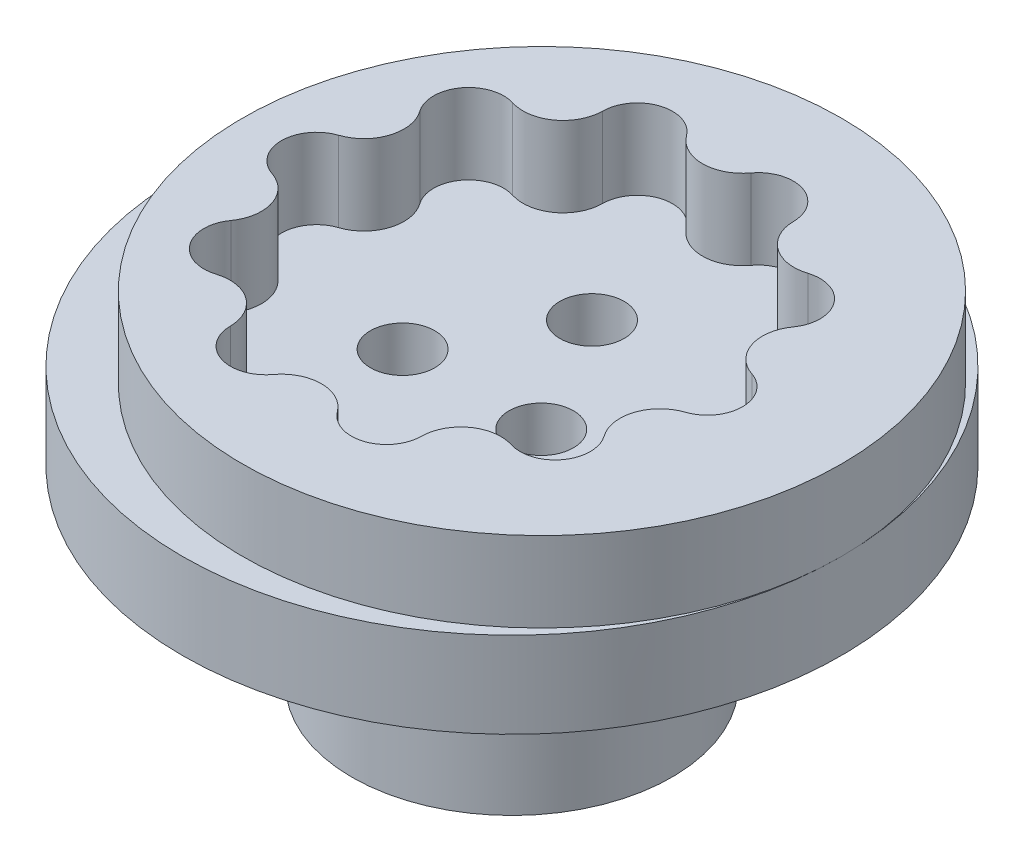
ISO-10303-21;
HEADER;
FILE_DESCRIPTION(('STEP AP214'),'2;1');
FILE_NAME('part.step','',(''),(''),'','','');
FILE_SCHEMA(('AUTOMOTIVE_DESIGN { 1 0 10303 214 1 1 1 1 }'));
ENDSEC;
DATA;
#1=APPLICATION_CONTEXT('core data for automotive mechanical design processes');
#2=APPLICATION_PROTOCOL_DEFINITION('international standard','automotive_design',2000,#1);
#3=PRODUCT_CONTEXT('',#1,'mechanical');
#4=PRODUCT('Part','Part','',(#3));
#5=PRODUCT_RELATED_PRODUCT_CATEGORY('part','',(#4));
#6=PRODUCT_DEFINITION_FORMATION('','',#4);
#7=PRODUCT_DEFINITION_CONTEXT('part definition',#1,'design');
#8=PRODUCT_DEFINITION('design','',#6,#7);
#9=PRODUCT_DEFINITION_SHAPE('','',#8);
#10=(LENGTH_UNIT() NAMED_UNIT(*) SI_UNIT(.MILLI.,.METRE.));
#11=(NAMED_UNIT(*) PLANE_ANGLE_UNIT() SI_UNIT($,.RADIAN.));
#12=(NAMED_UNIT(*) SI_UNIT($,.STERADIAN.) SOLID_ANGLE_UNIT());
#13=UNCERTAINTY_MEASURE_WITH_UNIT(LENGTH_MEASURE(1.E-05),#10,'distance_accuracy_value','');
#14=(GEOMETRIC_REPRESENTATION_CONTEXT(3) GLOBAL_UNCERTAINTY_ASSIGNED_CONTEXT((#13)) GLOBAL_UNIT_ASSIGNED_CONTEXT((#10,
#11,#12)) REPRESENTATION_CONTEXT('',''));
#15=CARTESIAN_POINT('',(0.,0.,0.));
#16=DIRECTION('',(0.,0.,1.));
#17=DIRECTION('',(1.,0.,0.));
#18=AXIS2_PLACEMENT_3D('',#15,#16,#17);
#19=CARTESIAN_POINT('',(0.,-6.810375,0.));
#20=DIRECTION('',(0.,1.,0.));
#21=DIRECTION('',(0.,0.,1.));
#22=AXIS2_PLACEMENT_3D('',#19,#20,#21);
#23=CYLINDRICAL_SURFACE('',#22,26.14295);
#24=CARTESIAN_POINT('',(0.,-6.810375,0.));
#25=DIRECTION('',(0.,1.,0.));
#26=DIRECTION('',(0.,0.,1.));
#27=AXIS2_PLACEMENT_3D('',#24,#25,#26);
#28=CIRCLE('',#27,26.14295);
#29=CARTESIAN_POINT('',(0.,-6.810375,26.14295));
#30=VERTEX_POINT('',#29);
#31=EDGE_CURVE('E335',#30,#30,#28,.T.);
#32=ORIENTED_EDGE('',*,*,#31,.T.);
#33=EDGE_LOOP('',(#32));
#34=FACE_BOUND('',#33,.T.);
#35=CARTESIAN_POINT('',(0.,0.,0.));
#36=DIRECTION('',(0.,1.,0.));
#37=DIRECTION('',(0.,0.,1.));
#38=AXIS2_PLACEMENT_3D('',#35,#36,#37);
#39=CIRCLE('',#38,26.14295);
#40=CARTESIAN_POINT('',(26.14295,0.,0.));
#41=VERTEX_POINT('',#40);
#42=EDGE_CURVE('E11',#41,#41,#39,.F.);
#43=ORIENTED_EDGE('',*,*,#42,.T.);
#44=EDGE_LOOP('',(#43));
#45=FACE_BOUND('',#44,.T.);
#46=ADVANCED_FACE('F38',(#34,#45),#23,.T.);
#47=CARTESIAN_POINT('',(0.,6.35,0.));
#48=DIRECTION('',(0.,1.,0.));
#49=DIRECTION('',(0.,0.,1.));
#50=AXIS2_PLACEMENT_3D('',#47,#48,#49);
#51=PLANE('',#50);
#52=CARTESIAN_POINT('',(-10.7494166939248,6.35,-14.795302793129));
#53=DIRECTION('',(0.,-1.,0.));
#54=DIRECTION('',(0.,0.,1.));
#55=AXIS2_PLACEMENT_3D('',#52,#53,#54);
#56=CIRCLE('',#55,3.175);
#57=CARTESIAN_POINT('',(-7.57452672067544,6.35,-14.7688706581247));
#58=VERTEX_POINT('',#57);
#59=CARTESIAN_POINT('',(-11.705373196694,6.35,-11.7676350166362));
#60=VERTEX_POINT('',#59);
#61=EDGE_CURVE('E202',#58,#60,#56,.T.);
#62=ORIENTED_EDGE('',*,*,#61,.F.);
#63=CARTESIAN_POINT('',(-4.79116776815351,6.35,-14.7456981638907));
#64=DIRECTION('',(0.,1.,0.));
#65=DIRECTION('',(0.,0.,-1.));
#66=AXIS2_PLACEMENT_3D('',#63,#64,#65);
#67=CIRCLE('',#66,2.78345541064933);
#68=CARTESIAN_POINT('',(-2.55300352448717,6.35,-16.4004624496567));
#69=VERTEX_POINT('',#68);
#70=EDGE_CURVE('E188',#69,#58,#67,.T.);
#71=ORIENTED_EDGE('',*,*,#70,.F.);
#72=CARTESIAN_POINT('',(0.,6.35,-18.288));
#73=DIRECTION('',(0.,-1.,0.));
#74=DIRECTION('',(0.,0.,-1.));
#75=AXIS2_PLACEMENT_3D('',#72,#73,#74);
#76=CIRCLE('',#75,3.175);
#77=CARTESIAN_POINT('',(2.55300352448717,6.35,-16.4004624496567));
#78=VERTEX_POINT('',#77);
#79=EDGE_CURVE('E177',#78,#69,#76,.T.);
#80=ORIENTED_EDGE('',*,*,#79,.F.);
#81=CARTESIAN_POINT('',(4.79116776815351,6.35,-14.7456981638907));
#82=DIRECTION('',(0.,1.,0.));
#83=DIRECTION('',(0.,0.,-1.));
#84=AXIS2_PLACEMENT_3D('',#81,#82,#83);
#85=CIRCLE('',#84,2.78345541064932);
#86=CARTESIAN_POINT('',(7.57452672067544,6.35,-14.7688706581247));
#87=VERTEX_POINT('',#86);
#88=EDGE_CURVE('E239',#87,#78,#85,.T.);
#89=ORIENTED_EDGE('',*,*,#88,.F.);
#90=CARTESIAN_POINT('',(10.7494166939248,6.35,-14.795302793129));
#91=DIRECTION('',(0.,-1.,0.));
#92=DIRECTION('',(0.,0.,1.));
#93=AXIS2_PLACEMENT_3D('',#90,#91,#92);
#94=CIRCLE('',#93,3.175);
#95=CARTESIAN_POINT('',(11.7053731966939,6.35,-11.7676350166362));
#96=VERTEX_POINT('',#95);
#97=EDGE_CURVE('E237',#96,#87,#94,.T.);
#98=ORIENTED_EDGE('',*,*,#97,.F.);
#99=CARTESIAN_POINT('',(12.5434400628289,6.35,-9.11334265313137));
#100=DIRECTION('',(0.,1.,0.));
#101=DIRECTION('',(0.,0.,-1.));
#102=AXIS2_PLACEMENT_3D('',#99,#100,#101);
#103=CIRCLE('',#102,2.78345541064933);
#104=CARTESIAN_POINT('',(14.8088452072343,6.35,-7.49607225064008));
#105=VERTEX_POINT('',#104);
#106=EDGE_CURVE('E235',#105,#96,#103,.T.);
#107=ORIENTED_EDGE('',*,*,#106,.F.);
#108=CARTESIAN_POINT('',(17.3929215700058,6.35,-5.65130279312901));
#109=DIRECTION('',(0.,-1.,0.));
#110=DIRECTION('',(0.,0.,1.));
#111=AXIS2_PLACEMENT_3D('',#108,#109,#110);
#112=CIRCLE('',#111,3.175);
#113=CARTESIAN_POINT('',(16.3866881587656,6.35,-2.63997097446405));
#114=VERTEX_POINT('',#113);
#115=EDGE_CURVE('E233',#114,#105,#112,.T.);
#116=ORIENTED_EDGE('',*,*,#115,.F.);
#117=CARTESIAN_POINT('',(15.5045445893507,6.35,0.));
#118=DIRECTION('',(0.,1.,0.));
#119=DIRECTION('',(0.,0.,-1.));
#120=AXIS2_PLACEMENT_3D('',#117,#118,#119);
#121=CIRCLE('',#120,2.78345541064933);
#122=CARTESIAN_POINT('',(16.3866881587657,6.35,2.63997097446412));
#123=VERTEX_POINT('',#122);
#124=EDGE_CURVE('E231',#123,#114,#121,.T.);
#125=ORIENTED_EDGE('',*,*,#124,.F.);
#126=CARTESIAN_POINT('',(17.3929215700058,6.35,5.65130279312908));
#127=DIRECTION('',(0.,-1.,0.));
#128=DIRECTION('',(0.,0.,1.));
#129=AXIS2_PLACEMENT_3D('',#126,#127,#128);
#130=CIRCLE('',#129,3.175);
#131=CARTESIAN_POINT('',(14.8088452072343,6.35,7.49607225064015));
#132=VERTEX_POINT('',#131);
#133=EDGE_CURVE('E229',#132,#123,#130,.T.);
#134=ORIENTED_EDGE('',*,*,#133,.F.);
#135=CARTESIAN_POINT('',(12.5434400628288,6.35,9.11334265313143));
#136=DIRECTION('',(0.,1.,0.));
#137=DIRECTION('',(0.,0.,-1.));
#138=AXIS2_PLACEMENT_3D('',#135,#136,#137);
#139=CIRCLE('',#138,2.78345541064933);
#140=CARTESIAN_POINT('',(11.7053731966939,6.35,11.7676350166362));
#141=VERTEX_POINT('',#140);
#142=EDGE_CURVE('E227',#141,#132,#139,.T.);
#143=ORIENTED_EDGE('',*,*,#142,.F.);
#144=CARTESIAN_POINT('',(10.7494166939248,6.35,14.7953027931291));
#145=DIRECTION('',(0.,-1.,0.));
#146=DIRECTION('',(0.,0.,1.));
#147=AXIS2_PLACEMENT_3D('',#144,#145,#146);
#148=CIRCLE('',#147,3.175);
#149=CARTESIAN_POINT('',(7.57452672067542,6.35,14.7688706581247));
#150=VERTEX_POINT('',#149);
#151=EDGE_CURVE('E225',#150,#141,#148,.T.);
#152=ORIENTED_EDGE('',*,*,#151,.F.);
#153=CARTESIAN_POINT('',(4.79116776815349,6.35,14.7456981638908));
#154=DIRECTION('',(0.,1.,0.));
#155=DIRECTION('',(0.,0.,-1.));
#156=AXIS2_PLACEMENT_3D('',#153,#154,#155);
#157=CIRCLE('',#156,2.78345541064933);
#158=CARTESIAN_POINT('',(2.55300352448715,6.35,16.4004624496567));
#159=VERTEX_POINT('',#158);
#160=EDGE_CURVE('E223',#159,#150,#157,.T.);
#161=ORIENTED_EDGE('',*,*,#160,.F.);
#162=CARTESIAN_POINT('',(0.,6.35,18.288));
#163=DIRECTION('',(0.,-1.,0.));
#164=DIRECTION('',(0.,0.,1.));
#165=AXIS2_PLACEMENT_3D('',#162,#163,#164);
#166=CIRCLE('',#165,3.175);
#167=CARTESIAN_POINT('',(-2.55300352448719,6.35,16.4004624496567));
#168=VERTEX_POINT('',#167);
#169=EDGE_CURVE('E221',#168,#159,#166,.T.);
#170=ORIENTED_EDGE('',*,*,#169,.F.);
#171=CARTESIAN_POINT('',(-4.79116776815352,6.35,14.7456981638908));
#172=DIRECTION('',(0.,1.,0.));
#173=DIRECTION('',(0.,0.,-1.));
#174=AXIS2_PLACEMENT_3D('',#171,#172,#173);
#175=CIRCLE('',#174,2.78345541064933);
#176=CARTESIAN_POINT('',(-7.57452672067546,6.35,14.7688706581247));
#177=VERTEX_POINT('',#176);
#178=EDGE_CURVE('E219',#177,#168,#175,.T.);
#179=ORIENTED_EDGE('',*,*,#178,.F.);
#180=CARTESIAN_POINT('',(-10.7494166939248,6.35,14.7953027931291));
#181=DIRECTION('',(0.,-1.,0.));
#182=DIRECTION('',(0.,0.,1.));
#183=AXIS2_PLACEMENT_3D('',#180,#181,#182);
#184=CIRCLE('',#183,3.175);
#185=CARTESIAN_POINT('',(-11.705373196694,6.35,11.7676350166362));
#186=VERTEX_POINT('',#185);
#187=EDGE_CURVE('E217',#186,#177,#184,.T.);
#188=ORIENTED_EDGE('',*,*,#187,.F.);
#189=CARTESIAN_POINT('',(-12.5434400628289,6.35,9.11334265313142));
#190=DIRECTION('',(0.,1.,0.));
#191=DIRECTION('',(0.,0.,-1.));
#192=AXIS2_PLACEMENT_3D('',#189,#190,#191);
#193=CIRCLE('',#192,2.78345541064933);
#194=CARTESIAN_POINT('',(-14.8088452072343,6.35,7.49607225064014));
#195=VERTEX_POINT('',#194);
#196=EDGE_CURVE('E215',#195,#186,#193,.T.);
#197=ORIENTED_EDGE('',*,*,#196,.F.);
#198=CARTESIAN_POINT('',(-17.3929215700058,6.35,5.65130279312907));
#199=DIRECTION('',(0.,-1.,0.));
#200=DIRECTION('',(0.,0.,1.));
#201=AXIS2_PLACEMENT_3D('',#198,#199,#200);
#202=CIRCLE('',#201,3.175);
#203=CARTESIAN_POINT('',(-16.3866881587657,6.35,2.6399709744641));
#204=VERTEX_POINT('',#203);
#205=EDGE_CURVE('E213',#204,#195,#202,.T.);
#206=ORIENTED_EDGE('',*,*,#205,.F.);
#207=CARTESIAN_POINT('',(-15.5045445893507,6.35,0.));
#208=DIRECTION('',(0.,1.,0.));
#209=DIRECTION('',(0.,0.,-1.));
#210=AXIS2_PLACEMENT_3D('',#207,#208,#209);
#211=CIRCLE('',#210,2.78345541064933);
#212=CARTESIAN_POINT('',(-16.3866881587657,6.35,-2.63997097446407));
#213=VERTEX_POINT('',#212);
#214=EDGE_CURVE('E211',#213,#204,#211,.T.);
#215=ORIENTED_EDGE('',*,*,#214,.F.);
#216=CARTESIAN_POINT('',(-17.3929215700058,6.35,-5.65130279312902));
#217=DIRECTION('',(0.,-1.,0.));
#218=DIRECTION('',(0.,0.,1.));
#219=AXIS2_PLACEMENT_3D('',#216,#217,#218);
#220=CIRCLE('',#219,3.175);
#221=CARTESIAN_POINT('',(-14.8088452072343,6.35,-7.4960722506401));
#222=VERTEX_POINT('',#221);
#223=EDGE_CURVE('E209',#222,#213,#220,.T.);
#224=ORIENTED_EDGE('',*,*,#223,.F.);
#225=CARTESIAN_POINT('',(-12.5434400628289,6.35,-9.11334265313138));
#226=DIRECTION('',(0.,1.,0.));
#227=DIRECTION('',(0.,0.,-1.));
#228=AXIS2_PLACEMENT_3D('',#225,#226,#227);
#229=CIRCLE('',#228,2.78345541064933);
#230=EDGE_CURVE('E204',#60,#222,#229,.T.);
#231=ORIENTED_EDGE('',*,*,#230,.F.);
#232=EDGE_LOOP('',(#62,#71,#80,#89,#98,#107,#116,#125,#134,#143,#152,#161,#170,#179,#188,#197,
#206,#215,#224,#231));
#233=FACE_BOUND('',#232,.T.);
#234=CARTESIAN_POINT('',(2.38125,6.35,0.));
#235=DIRECTION('',(0.,1.,0.));
#236=DIRECTION('',(0.,0.,-1.));
#237=AXIS2_PLACEMENT_3D('',#234,#235,#236);
#238=CIRCLE('',#237,23.7617);
#239=CARTESIAN_POINT('',(2.38125,6.35,-23.7617));
#240=VERTEX_POINT('',#239);
#241=EDGE_CURVE('E357',#240,#240,#238,.T.);
#242=ORIENTED_EDGE('',*,*,#241,.T.);
#243=EDGE_LOOP('',(#242));
#244=FACE_BOUND('',#243,.T.);
#245=ADVANCED_FACE('F199',(#233,#244),#51,.T.);
#246=CARTESIAN_POINT('',(0.,-6.810375,0.));
#247=DIRECTION('',(0.,1.,0.));
#248=DIRECTION('',(0.,0.,1.));
#249=AXIS2_PLACEMENT_3D('',#246,#247,#248);
#250=PLANE('',#249);
#251=ORIENTED_EDGE('',*,*,#31,.F.);
#252=EDGE_LOOP('',(#251));
#253=FACE_BOUND('',#252,.T.);
#254=CARTESIAN_POINT('',(0.,-6.810375,0.));
#255=DIRECTION('',(0.,1.,0.));
#256=DIRECTION('',(0.,0.,1.));
#257=AXIS2_PLACEMENT_3D('',#254,#255,#256);
#258=CIRCLE('',#257,12.7);
#259=CARTESIAN_POINT('',(0.,-6.810375,12.7));
#260=VERTEX_POINT('',#259);
#261=EDGE_CURVE('E45',#260,#260,#258,.F.);
#262=ORIENTED_EDGE('',*,*,#261,.F.);
#263=EDGE_LOOP('',(#262));
#264=FACE_BOUND('',#263,.T.);
#265=ADVANCED_FACE('F375',(#253,#264),#250,.F.);
#266=CARTESIAN_POINT('',(0.,-21.891625,0.));
#267=DIRECTION('',(0.,1.,0.));
#268=DIRECTION('',(0.,0.,1.));
#269=AXIS2_PLACEMENT_3D('',#266,#267,#268);
#270=CYLINDRICAL_SURFACE('',#269,12.7);
#271=CARTESIAN_POINT('',(0.,-21.891625,0.));
#272=DIRECTION('',(0.,-1.,0.));
#273=DIRECTION('',(0.,0.,-1.));
#274=AXIS2_PLACEMENT_3D('',#271,#272,#273);
#275=CIRCLE('',#274,12.7);
#276=CARTESIAN_POINT('',(0.,-21.891625,12.7));
#277=VERTEX_POINT('',#276);
#278=EDGE_CURVE('E195',#277,#277,#275,.T.);
#279=CARTESIAN_POINT('',(0.,-21.891625,12.7));
#280=CARTESIAN_POINT('',(0.,-21.7345286458333,12.7));
#281=CARTESIAN_POINT('',(0.,-21.5774322916667,12.7));
#282=CARTESIAN_POINT('',(0.,-21.2632395833333,12.7));
#283=CARTESIAN_POINT('',(0.,-21.1061432291667,12.7));
#284=CARTESIAN_POINT('',(0.,-20.7919505208333,12.7));
#285=CARTESIAN_POINT('',(0.,-20.6348541666667,12.7));
#286=CARTESIAN_POINT('',(0.,-20.3206614583333,12.7));
#287=CARTESIAN_POINT('',(0.,-20.1635651041667,12.7));
#288=CARTESIAN_POINT('',(0.,-19.8493723958333,12.7));
#289=CARTESIAN_POINT('',(0.,-19.6922760416667,12.7));
#290=CARTESIAN_POINT('',(0.,-19.3780833333333,12.7));
#291=CARTESIAN_POINT('',(0.,-19.2209869791667,12.7));
#292=CARTESIAN_POINT('',(0.,-18.9067942708333,12.7));
#293=CARTESIAN_POINT('',(0.,-18.7496979166667,12.7));
#294=CARTESIAN_POINT('',(0.,-18.4355052083333,12.7));
#295=CARTESIAN_POINT('',(0.,-18.2784088541667,12.7));
#296=CARTESIAN_POINT('',(0.,-17.9642161458333,12.7));
#297=CARTESIAN_POINT('',(0.,-17.8071197916667,12.7));
#298=CARTESIAN_POINT('',(0.,-17.4929270833333,12.7));
#299=CARTESIAN_POINT('',(0.,-17.3358307291667,12.7));
#300=CARTESIAN_POINT('',(0.,-17.0216380208333,12.7));
#301=CARTESIAN_POINT('',(0.,-16.8645416666667,12.7));
#302=CARTESIAN_POINT('',(0.,-16.5503489583333,12.7));
#303=CARTESIAN_POINT('',(0.,-16.3932526041667,12.7));
#304=CARTESIAN_POINT('',(0.,-16.0790598958333,12.7));
#305=CARTESIAN_POINT('',(0.,-15.9219635416667,12.7));
#306=CARTESIAN_POINT('',(0.,-15.6077708333333,12.7));
#307=CARTESIAN_POINT('',(0.,-15.4506744791667,12.7));
#308=CARTESIAN_POINT('',(0.,-15.1364817708333,12.7));
#309=CARTESIAN_POINT('',(0.,-14.9793854166667,12.7));
#310=CARTESIAN_POINT('',(0.,-14.6651927083333,12.7));
#311=CARTESIAN_POINT('',(0.,-14.5080963541667,12.7));
#312=CARTESIAN_POINT('',(0.,-14.1939036458333,12.7));
#313=CARTESIAN_POINT('',(0.,-14.0368072916667,12.7));
#314=CARTESIAN_POINT('',(0.,-13.7226145833333,12.7));
#315=CARTESIAN_POINT('',(0.,-13.5655182291667,12.7));
#316=CARTESIAN_POINT('',(0.,-13.2513255208333,12.7));
#317=CARTESIAN_POINT('',(0.,-13.0942291666667,12.7));
#318=CARTESIAN_POINT('',(0.,-12.7800364583333,12.7));
#319=CARTESIAN_POINT('',(0.,-12.6229401041667,12.7));
#320=CARTESIAN_POINT('',(0.,-12.3087473958333,12.7));
#321=CARTESIAN_POINT('',(0.,-12.1516510416667,12.7));
#322=CARTESIAN_POINT('',(0.,-11.8374583333333,12.7));
#323=CARTESIAN_POINT('',(0.,-11.6803619791667,12.7));
#324=CARTESIAN_POINT('',(0.,-11.3661692708333,12.7));
#325=CARTESIAN_POINT('',(0.,-11.2090729166667,12.7));
#326=CARTESIAN_POINT('',(0.,-10.8948802083333,12.7));
#327=CARTESIAN_POINT('',(0.,-10.7377838541667,12.7));
#328=CARTESIAN_POINT('',(0.,-10.4235911458333,12.7));
#329=CARTESIAN_POINT('',(0.,-10.2664947916667,12.7));
#330=CARTESIAN_POINT('',(0.,-9.95230208333333,12.7));
#331=CARTESIAN_POINT('',(0.,-9.79520572916667,12.7));
#332=CARTESIAN_POINT('',(0.,-9.48101302083334,12.7));
#333=CARTESIAN_POINT('',(0.,-9.32391666666667,12.7));
#334=CARTESIAN_POINT('',(0.,-9.00972395833333,12.7));
#335=CARTESIAN_POINT('',(0.,-8.85262760416667,12.7));
#336=CARTESIAN_POINT('',(0.,-8.53843489583333,12.7));
#337=CARTESIAN_POINT('',(0.,-8.38133854166667,12.7));
#338=CARTESIAN_POINT('',(0.,-8.06714583333333,12.7));
#339=CARTESIAN_POINT('',(0.,-7.91004947916667,12.7));
#340=CARTESIAN_POINT('',(0.,-7.59585677083334,12.7));
#341=CARTESIAN_POINT('',(0.,-7.43876041666667,12.7));
#342=CARTESIAN_POINT('',(0.,-7.12456770833334,12.7));
#343=CARTESIAN_POINT('',(0.,-6.96747135416667,12.7));
#344=CARTESIAN_POINT('',(0.,-6.810375,12.7));
#345=B_SPLINE_CURVE_WITH_KNOTS('',3,(#279,#280,#281,#282,#283,#284,#285,#286,#287,#288,#289,
#290,#291,#292,#293,#294,#295,#296,#297,#298,#299,#300,#301,#302,#303,#304,#305,#306,#307,#308,
#309,#310,#311,#312,#313,#314,#315,#316,#317,#318,#319,#320,#321,#322,#323,#324,#325,#326,#327,
#328,#329,#330,#331,#332,#333,#334,#335,#336,#337,#338,#339,#340,#341,#342,#343,#344),
.UNSPECIFIED.,.F.,.F.,(4,2,2,2,2,2,2,2,2,2,2,2,2,2,2,2,2,2,2,2,2,2,2,2,2,2,2,2,2,2,2,2,4),(0.,
0.471289062499998,0.942578124999999,1.4138671875,1.88515625,2.3564453125,2.827734375,
3.2990234375,3.7703125,4.2416015625,4.712890625,5.1841796875,5.65546875,6.12675781249999,
6.598046875,7.0693359375,7.540625,8.0119140625,8.48320312499999,8.95449218749999,
9.42578124999999,9.89707031249999,10.368359375,10.8396484375,11.3109375,11.7822265625,
12.253515625,12.7248046875,13.19609375,13.6673828125,14.138671875,14.6099609375,15.08125),.UNSPECIFIED.);
#346=EDGE_CURVE('BSEAM368',#277,#260,#345,.T.);
#347=ORIENTED_EDGE('',*,*,#278,.F.);
#348=ORIENTED_EDGE('',*,*,#261,.T.);
#349=ORIENTED_EDGE('',*,*,#346,.T.);
#350=ORIENTED_EDGE('',*,*,#346,.F.);
#351=EDGE_LOOP('',(#347,#349,#348,#350));
#352=FACE_BOUND('',#351,.T.);
#353=ADVANCED_FACE('F368',(#352),#270,.T.);
#354=CARTESIAN_POINT('',(0.,-21.891625,0.));
#355=DIRECTION('',(0.,-1.,0.));
#356=DIRECTION('',(0.,0.,-1.));
#357=AXIS2_PLACEMENT_3D('',#354,#355,#356);
#358=PLANE('',#357);
#359=CARTESIAN_POINT('',(0.,-21.891625,-6.35));
#360=DIRECTION('',(0.,-1.,0.));
#361=DIRECTION('',(0.,0.,-1.));
#362=AXIS2_PLACEMENT_3D('',#359,#360,#361);
#363=CIRCLE('',#362,2.55269999999999);
#364=CARTESIAN_POINT('',(0.,-21.891625,-8.90269999999999));
#365=VERTEX_POINT('',#364);
#366=EDGE_CURVE('E348',#365,#365,#363,.T.);
#367=ORIENTED_EDGE('',*,*,#366,.F.);
#368=EDGE_LOOP('',(#367));
#369=FACE_BOUND('',#368,.T.);
#370=CARTESIAN_POINT('',(-5.49926131403113,-21.891625,3.1750000000001));
#371=DIRECTION('',(0.,-1.,0.));
#372=DIRECTION('',(0.,0.,-1.));
#373=AXIS2_PLACEMENT_3D('',#370,#371,#372);
#374=CIRCLE('',#373,2.55269999999999);
#375=CARTESIAN_POINT('',(-5.49926131403113,-21.891625,0.622300000000115));
#376=VERTEX_POINT('',#375);
#377=EDGE_CURVE('E345',#376,#376,#374,.T.);
#378=ORIENTED_EDGE('',*,*,#377,.F.);
#379=EDGE_LOOP('',(#378));
#380=FACE_BOUND('',#379,.T.);
#381=CARTESIAN_POINT('',(5.49926131403126,-21.891625,3.17499999999987));
#382=DIRECTION('',(0.,-1.,0.));
#383=DIRECTION('',(0.,0.,-1.));
#384=AXIS2_PLACEMENT_3D('',#381,#382,#383);
#385=CIRCLE('',#384,2.55269999999999);
#386=CARTESIAN_POINT('',(5.49926131403126,-21.891625,0.622299999999885));
#387=VERTEX_POINT('',#386);
#388=EDGE_CURVE('E342',#387,#387,#385,.T.);
#389=ORIENTED_EDGE('',*,*,#388,.F.);
#390=EDGE_LOOP('',(#389));
#391=FACE_BOUND('',#390,.T.);
#392=ORIENTED_EDGE('',*,*,#278,.T.);
#393=EDGE_LOOP('',(#392));
#394=FACE_BOUND('',#393,.T.);
#395=ADVANCED_FACE('F365',(#369,#380,#391,#394),#358,.T.);
#396=CARTESIAN_POINT('',(-4.79116776815351,6.35,-14.7456981638907));
#397=DIRECTION('',(0.,-1.,0.));
#398=DIRECTION('',(0.,0.,-1.));
#399=AXIS2_PLACEMENT_3D('',#396,#397,#398);
#400=CYLINDRICAL_SURFACE('',#399,2.78345541064933);
#401=CARTESIAN_POINT('',(-4.79116776815351,0.,-14.7456981638907));
#402=DIRECTION('',(0.,1.,0.));
#403=DIRECTION('',(0.,0.,-1.));
#404=AXIS2_PLACEMENT_3D('',#401,#402,#403);
#405=CIRCLE('',#404,2.78345541064933);
#406=CARTESIAN_POINT('',(-2.55300352448718,0.,-16.4004624496567));
#407=VERTEX_POINT('',#406);
#408=CARTESIAN_POINT('',(-7.57452672067543,0.,-14.7688706581247));
#409=VERTEX_POINT('',#408);
#410=EDGE_CURVE('E58',#407,#409,#405,.T.);
#411=ORIENTED_EDGE('',*,*,#410,.F.);
#412=DIRECTION('',(0.,-1.,0.));
#413=VECTOR('',#412,1.);
#414=CARTESIAN_POINT('',(-2.55300352448717,6.35,-16.4004624496567));
#415=LINE('',#414,#413);
#416=EDGE_CURVE('E181',#69,#407,#415,.T.);
#417=ORIENTED_EDGE('',*,*,#416,.F.);
#418=ORIENTED_EDGE('',*,*,#70,.T.);
#419=DIRECTION('',(0.,-1.,0.));
#420=VECTOR('',#419,1.);
#421=CARTESIAN_POINT('',(-7.57452672067544,6.35,-14.7688706581247));
#422=LINE('',#421,#420);
#423=EDGE_CURVE('E196',#58,#409,#422,.T.);
#424=ORIENTED_EDGE('',*,*,#423,.T.);
#425=EDGE_LOOP('',(#411,#417,#418,#424));
#426=FACE_BOUND('',#425,.T.);
#427=ADVANCED_FACE('F192',(#426),#400,.F.);
#428=CARTESIAN_POINT('',(-10.7494166939248,6.35,-14.795302793129));
#429=DIRECTION('',(0.,-1.,0.));
#430=DIRECTION('',(0.,0.,-1.));
#431=AXIS2_PLACEMENT_3D('',#428,#429,#430);
#432=CYLINDRICAL_SURFACE('',#431,3.175);
#433=CARTESIAN_POINT('',(-10.7494166939248,0.,-14.795302793129));
#434=DIRECTION('',(0.,-1.,0.));
#435=DIRECTION('',(0.,0.,-1.));
#436=AXIS2_PLACEMENT_3D('',#433,#434,#435);
#437=CIRCLE('',#436,3.175);
#438=CARTESIAN_POINT('',(-11.705373196694,0.,-11.7676350166362));
#439=VERTEX_POINT('',#438);
#440=EDGE_CURVE('E242',#409,#439,#437,.T.);
#441=ORIENTED_EDGE('',*,*,#440,.F.);
#442=ORIENTED_EDGE('',*,*,#423,.F.);
#443=ORIENTED_EDGE('',*,*,#61,.T.);
#444=DIRECTION('',(0.,-1.,0.));
#445=VECTOR('',#444,1.);
#446=CARTESIAN_POINT('',(-11.705373196694,6.35,-11.7676350166362));
#447=LINE('',#446,#445);
#448=EDGE_CURVE('E329',#60,#439,#447,.T.);
#449=ORIENTED_EDGE('',*,*,#448,.T.);
#450=EDGE_LOOP('',(#441,#442,#443,#449));
#451=FACE_BOUND('',#450,.T.);
#452=ADVANCED_FACE('F484',(#451),#432,.T.);
#453=CARTESIAN_POINT('',(-12.5434400628289,6.35,-9.11334265313138));
#454=DIRECTION('',(0.,-1.,0.));
#455=DIRECTION('',(0.,0.,-1.));
#456=AXIS2_PLACEMENT_3D('',#453,#454,#455);
#457=CYLINDRICAL_SURFACE('',#456,2.78345541064933);
#458=CARTESIAN_POINT('',(-12.5434400628289,0.,-9.11334265313138));
#459=DIRECTION('',(0.,1.,0.));
#460=DIRECTION('',(0.,0.,-1.));
#461=AXIS2_PLACEMENT_3D('',#458,#459,#460);
#462=CIRCLE('',#461,2.78345541064933);
#463=CARTESIAN_POINT('',(-14.8088452072343,0.,-7.4960722506401));
#464=VERTEX_POINT('',#463);
#465=EDGE_CURVE('E245',#439,#464,#462,.T.);
#466=ORIENTED_EDGE('',*,*,#465,.F.);
#467=ORIENTED_EDGE('',*,*,#448,.F.);
#468=ORIENTED_EDGE('',*,*,#230,.T.);
#469=DIRECTION('',(0.,-1.,0.));
#470=VECTOR('',#469,1.);
#471=CARTESIAN_POINT('',(-14.8088452072343,6.35,-7.4960722506401));
#472=LINE('',#471,#470);
#473=EDGE_CURVE('E326',#222,#464,#472,.T.);
#474=ORIENTED_EDGE('',*,*,#473,.T.);
#475=EDGE_LOOP('',(#466,#467,#468,#474));
#476=FACE_BOUND('',#475,.T.);
#477=ADVANCED_FACE('F480',(#476),#457,.F.);
#478=CARTESIAN_POINT('',(-17.3929215700058,6.35,-5.65130279312903));
#479=DIRECTION('',(0.,-1.,0.));
#480=DIRECTION('',(0.,0.,-1.));
#481=AXIS2_PLACEMENT_3D('',#478,#479,#480);
#482=CYLINDRICAL_SURFACE('',#481,3.175);
#483=CARTESIAN_POINT('',(-17.3929215700058,0.,-5.65130279312903));
#484=DIRECTION('',(0.,-1.,0.));
#485=DIRECTION('',(0.,0.,-1.));
#486=AXIS2_PLACEMENT_3D('',#483,#484,#485);
#487=CIRCLE('',#486,3.175);
#488=CARTESIAN_POINT('',(-16.3866881587657,0.,-2.63997097446407));
#489=VERTEX_POINT('',#488);
#490=EDGE_CURVE('E247',#464,#489,#487,.T.);
#491=ORIENTED_EDGE('',*,*,#490,.F.);
#492=ORIENTED_EDGE('',*,*,#473,.F.);
#493=ORIENTED_EDGE('',*,*,#223,.T.);
#494=DIRECTION('',(0.,-1.,0.));
#495=VECTOR('',#494,1.);
#496=CARTESIAN_POINT('',(-16.3866881587657,6.35,-2.63997097446407));
#497=LINE('',#496,#495);
#498=EDGE_CURVE('E323',#213,#489,#497,.T.);
#499=ORIENTED_EDGE('',*,*,#498,.T.);
#500=EDGE_LOOP('',(#491,#492,#493,#499));
#501=FACE_BOUND('',#500,.T.);
#502=ADVANCED_FACE('F476',(#501),#482,.T.);
#503=CARTESIAN_POINT('',(-15.5045445893507,6.35,0.));
#504=DIRECTION('',(0.,-1.,0.));
#505=DIRECTION('',(0.,0.,-1.));
#506=AXIS2_PLACEMENT_3D('',#503,#504,#505);
#507=CYLINDRICAL_SURFACE('',#506,2.78345541064933);
#508=CARTESIAN_POINT('',(-15.5045445893507,0.,0.));
#509=DIRECTION('',(0.,1.,0.));
#510=DIRECTION('',(0.,0.,-1.));
#511=AXIS2_PLACEMENT_3D('',#508,#509,#510);
#512=CIRCLE('',#511,2.78345541064933);
#513=CARTESIAN_POINT('',(-16.3866881587657,0.,2.6399709744641));
#514=VERTEX_POINT('',#513);
#515=EDGE_CURVE('E249',#489,#514,#512,.T.);
#516=ORIENTED_EDGE('',*,*,#515,.F.);
#517=ORIENTED_EDGE('',*,*,#498,.F.);
#518=ORIENTED_EDGE('',*,*,#214,.T.);
#519=DIRECTION('',(0.,-1.,0.));
#520=VECTOR('',#519,1.);
#521=CARTESIAN_POINT('',(-16.3866881587657,6.35,2.6399709744641));
#522=LINE('',#521,#520);
#523=EDGE_CURVE('E320',#204,#514,#522,.T.);
#524=ORIENTED_EDGE('',*,*,#523,.T.);
#525=EDGE_LOOP('',(#516,#517,#518,#524));
#526=FACE_BOUND('',#525,.T.);
#527=ADVANCED_FACE('F472',(#526),#507,.F.);
#528=CARTESIAN_POINT('',(-17.3929215700058,6.35,5.65130279312906));
#529=DIRECTION('',(0.,-1.,0.));
#530=DIRECTION('',(0.,0.,-1.));
#531=AXIS2_PLACEMENT_3D('',#528,#529,#530);
#532=CYLINDRICAL_SURFACE('',#531,3.175);
#533=CARTESIAN_POINT('',(-17.3929215700058,0.,5.65130279312906));
#534=DIRECTION('',(0.,-1.,0.));
#535=DIRECTION('',(0.,0.,-1.));
#536=AXIS2_PLACEMENT_3D('',#533,#534,#535);
#537=CIRCLE('',#536,3.175);
#538=CARTESIAN_POINT('',(-14.8088452072343,0.,7.49607225064014));
#539=VERTEX_POINT('',#538);
#540=EDGE_CURVE('E251',#514,#539,#537,.T.);
#541=ORIENTED_EDGE('',*,*,#540,.F.);
#542=ORIENTED_EDGE('',*,*,#523,.F.);
#543=ORIENTED_EDGE('',*,*,#205,.T.);
#544=DIRECTION('',(0.,-1.,0.));
#545=VECTOR('',#544,1.);
#546=CARTESIAN_POINT('',(-14.8088452072343,6.35,7.49607225064014));
#547=LINE('',#546,#545);
#548=EDGE_CURVE('E317',#195,#539,#547,.T.);
#549=ORIENTED_EDGE('',*,*,#548,.T.);
#550=EDGE_LOOP('',(#541,#542,#543,#549));
#551=FACE_BOUND('',#550,.T.);
#552=ADVANCED_FACE('F468',(#551),#532,.T.);
#553=CARTESIAN_POINT('',(-12.5434400628289,6.35,9.11334265313142));
#554=DIRECTION('',(0.,-1.,0.));
#555=DIRECTION('',(0.,0.,-1.));
#556=AXIS2_PLACEMENT_3D('',#553,#554,#555);
#557=CYLINDRICAL_SURFACE('',#556,2.78345541064933);
#558=CARTESIAN_POINT('',(-12.5434400628289,0.,9.11334265313142));
#559=DIRECTION('',(0.,1.,0.));
#560=DIRECTION('',(0.,0.,-1.));
#561=AXIS2_PLACEMENT_3D('',#558,#559,#560);
#562=CIRCLE('',#561,2.78345541064933);
#563=CARTESIAN_POINT('',(-11.705373196694,0.,11.7676350166362));
#564=VERTEX_POINT('',#563);
#565=EDGE_CURVE('E253',#539,#564,#562,.T.);
#566=ORIENTED_EDGE('',*,*,#565,.F.);
#567=ORIENTED_EDGE('',*,*,#548,.F.);
#568=ORIENTED_EDGE('',*,*,#196,.T.);
#569=DIRECTION('',(0.,-1.,0.));
#570=VECTOR('',#569,1.);
#571=CARTESIAN_POINT('',(-11.705373196694,6.35,11.7676350166362));
#572=LINE('',#571,#570);
#573=EDGE_CURVE('E314',#186,#564,#572,.T.);
#574=ORIENTED_EDGE('',*,*,#573,.T.);
#575=EDGE_LOOP('',(#566,#567,#568,#574));
#576=FACE_BOUND('',#575,.T.);
#577=ADVANCED_FACE('F464',(#576),#557,.F.);
#578=CARTESIAN_POINT('',(-10.7494166939248,6.35,14.7953027931291));
#579=DIRECTION('',(0.,-1.,0.));
#580=DIRECTION('',(0.,0.,-1.));
#581=AXIS2_PLACEMENT_3D('',#578,#579,#580);
#582=CYLINDRICAL_SURFACE('',#581,3.175);
#583=CARTESIAN_POINT('',(-10.7494166939248,0.,14.7953027931291));
#584=DIRECTION('',(0.,-1.,0.));
#585=DIRECTION('',(0.,0.,-1.));
#586=AXIS2_PLACEMENT_3D('',#583,#584,#585);
#587=CIRCLE('',#586,3.175);
#588=CARTESIAN_POINT('',(-7.57452672067546,0.,14.7688706581247));
#589=VERTEX_POINT('',#588);
#590=EDGE_CURVE('E255',#564,#589,#587,.T.);
#591=ORIENTED_EDGE('',*,*,#590,.F.);
#592=ORIENTED_EDGE('',*,*,#573,.F.);
#593=ORIENTED_EDGE('',*,*,#187,.T.);
#594=DIRECTION('',(0.,-1.,0.));
#595=VECTOR('',#594,1.);
#596=CARTESIAN_POINT('',(-7.57452672067546,6.35,14.7688706581247));
#597=LINE('',#596,#595);
#598=EDGE_CURVE('E311',#177,#589,#597,.T.);
#599=ORIENTED_EDGE('',*,*,#598,.T.);
#600=EDGE_LOOP('',(#591,#592,#593,#599));
#601=FACE_BOUND('',#600,.T.);
#602=ADVANCED_FACE('F460',(#601),#582,.T.);
#603=CARTESIAN_POINT('',(-4.79116776815352,6.35,14.7456981638908));
#604=DIRECTION('',(0.,-1.,0.));
#605=DIRECTION('',(0.,0.,-1.));
#606=AXIS2_PLACEMENT_3D('',#603,#604,#605);
#607=CYLINDRICAL_SURFACE('',#606,2.78345541064933);
#608=CARTESIAN_POINT('',(-4.79116776815352,0.,14.7456981638908));
#609=DIRECTION('',(0.,1.,0.));
#610=DIRECTION('',(0.,0.,-1.));
#611=AXIS2_PLACEMENT_3D('',#608,#609,#610);
#612=CIRCLE('',#611,2.78345541064933);
#613=CARTESIAN_POINT('',(-2.55300352448719,0.,16.4004624496567));
#614=VERTEX_POINT('',#613);
#615=EDGE_CURVE('E257',#589,#614,#612,.T.);
#616=ORIENTED_EDGE('',*,*,#615,.F.);
#617=ORIENTED_EDGE('',*,*,#598,.F.);
#618=ORIENTED_EDGE('',*,*,#178,.T.);
#619=DIRECTION('',(0.,-1.,0.));
#620=VECTOR('',#619,1.);
#621=CARTESIAN_POINT('',(-2.55300352448719,6.35,16.4004624496567));
#622=LINE('',#621,#620);
#623=EDGE_CURVE('E308',#168,#614,#622,.T.);
#624=ORIENTED_EDGE('',*,*,#623,.T.);
#625=EDGE_LOOP('',(#616,#617,#618,#624));
#626=FACE_BOUND('',#625,.T.);
#627=ADVANCED_FACE('F456',(#626),#607,.F.);
#628=CARTESIAN_POINT('',(0.,6.35,18.288));
#629=DIRECTION('',(0.,-1.,0.));
#630=DIRECTION('',(0.,0.,-1.));
#631=AXIS2_PLACEMENT_3D('',#628,#629,#630);
#632=CYLINDRICAL_SURFACE('',#631,3.175);
#633=CARTESIAN_POINT('',(0.,0.,18.288));
#634=DIRECTION('',(0.,-1.,0.));
#635=DIRECTION('',(0.,0.,-1.));
#636=AXIS2_PLACEMENT_3D('',#633,#634,#635);
#637=CIRCLE('',#636,3.175);
#638=CARTESIAN_POINT('',(2.55300352448715,0.,16.4004624496567));
#639=VERTEX_POINT('',#638);
#640=EDGE_CURVE('E259',#614,#639,#637,.T.);
#641=ORIENTED_EDGE('',*,*,#640,.F.);
#642=ORIENTED_EDGE('',*,*,#623,.F.);
#643=ORIENTED_EDGE('',*,*,#169,.T.);
#644=DIRECTION('',(0.,-1.,0.));
#645=VECTOR('',#644,1.);
#646=CARTESIAN_POINT('',(2.55300352448715,6.35,16.4004624496567));
#647=LINE('',#646,#645);
#648=EDGE_CURVE('E305',#159,#639,#647,.T.);
#649=ORIENTED_EDGE('',*,*,#648,.T.);
#650=EDGE_LOOP('',(#641,#642,#643,#649));
#651=FACE_BOUND('',#650,.T.);
#652=ADVANCED_FACE('F452',(#651),#632,.T.);
#653=CARTESIAN_POINT('',(4.79116776815349,6.35,14.7456981638908));
#654=DIRECTION('',(0.,-1.,0.));
#655=DIRECTION('',(0.,0.,-1.));
#656=AXIS2_PLACEMENT_3D('',#653,#654,#655);
#657=CYLINDRICAL_SURFACE('',#656,2.78345541064933);
#658=CARTESIAN_POINT('',(4.79116776815349,0.,14.7456981638908));
#659=DIRECTION('',(0.,1.,0.));
#660=DIRECTION('',(0.,0.,-1.));
#661=AXIS2_PLACEMENT_3D('',#658,#659,#660);
#662=CIRCLE('',#661,2.78345541064933);
#663=CARTESIAN_POINT('',(7.57452672067541,0.,14.7688706581247));
#664=VERTEX_POINT('',#663);
#665=EDGE_CURVE('E261',#639,#664,#662,.T.);
#666=ORIENTED_EDGE('',*,*,#665,.F.);
#667=ORIENTED_EDGE('',*,*,#648,.F.);
#668=ORIENTED_EDGE('',*,*,#160,.T.);
#669=DIRECTION('',(0.,-1.,0.));
#670=VECTOR('',#669,1.);
#671=CARTESIAN_POINT('',(7.57452672067542,6.35,14.7688706581247));
#672=LINE('',#671,#670);
#673=EDGE_CURVE('E302',#150,#664,#672,.T.);
#674=ORIENTED_EDGE('',*,*,#673,.T.);
#675=EDGE_LOOP('',(#666,#667,#668,#674));
#676=FACE_BOUND('',#675,.T.);
#677=ADVANCED_FACE('F448',(#676),#657,.F.);
#678=CARTESIAN_POINT('',(10.7494166939247,6.35,14.7953027931291));
#679=DIRECTION('',(0.,-1.,0.));
#680=DIRECTION('',(0.,0.,-1.));
#681=AXIS2_PLACEMENT_3D('',#678,#679,#680);
#682=CYLINDRICAL_SURFACE('',#681,3.175);
#683=CARTESIAN_POINT('',(10.7494166939247,0.,14.7953027931291));
#684=DIRECTION('',(0.,-1.,0.));
#685=DIRECTION('',(0.,0.,-1.));
#686=AXIS2_PLACEMENT_3D('',#683,#684,#685);
#687=CIRCLE('',#686,3.175);
#688=CARTESIAN_POINT('',(11.7053731966939,0.,11.7676350166362));
#689=VERTEX_POINT('',#688);
#690=EDGE_CURVE('E263',#664,#689,#687,.T.);
#691=ORIENTED_EDGE('',*,*,#690,.F.);
#692=ORIENTED_EDGE('',*,*,#673,.F.);
#693=ORIENTED_EDGE('',*,*,#151,.T.);
#694=DIRECTION('',(0.,-1.,0.));
#695=VECTOR('',#694,1.);
#696=CARTESIAN_POINT('',(11.7053731966939,6.35,11.7676350166362));
#697=LINE('',#696,#695);
#698=EDGE_CURVE('E299',#141,#689,#697,.T.);
#699=ORIENTED_EDGE('',*,*,#698,.T.);
#700=EDGE_LOOP('',(#691,#692,#693,#699));
#701=FACE_BOUND('',#700,.T.);
#702=ADVANCED_FACE('F444',(#701),#682,.T.);
#703=CARTESIAN_POINT('',(12.5434400628288,6.35,9.11334265313143));
#704=DIRECTION('',(0.,-1.,0.));
#705=DIRECTION('',(0.,0.,-1.));
#706=AXIS2_PLACEMENT_3D('',#703,#704,#705);
#707=CYLINDRICAL_SURFACE('',#706,2.78345541064933);
#708=CARTESIAN_POINT('',(12.5434400628288,0.,9.11334265313143));
#709=DIRECTION('',(0.,1.,0.));
#710=DIRECTION('',(0.,0.,-1.));
#711=AXIS2_PLACEMENT_3D('',#708,#709,#710);
#712=CIRCLE('',#711,2.78345541064933);
#713=CARTESIAN_POINT('',(14.8088452072343,0.,7.49607225064015));
#714=VERTEX_POINT('',#713);
#715=EDGE_CURVE('E265',#689,#714,#712,.T.);
#716=ORIENTED_EDGE('',*,*,#715,.F.);
#717=ORIENTED_EDGE('',*,*,#698,.F.);
#718=ORIENTED_EDGE('',*,*,#142,.T.);
#719=DIRECTION('',(0.,-1.,0.));
#720=VECTOR('',#719,1.);
#721=CARTESIAN_POINT('',(14.8088452072343,6.35,7.49607225064015));
#722=LINE('',#721,#720);
#723=EDGE_CURVE('E296',#132,#714,#722,.T.);
#724=ORIENTED_EDGE('',*,*,#723,.T.);
#725=EDGE_LOOP('',(#716,#717,#718,#724));
#726=FACE_BOUND('',#725,.T.);
#727=ADVANCED_FACE('F440',(#726),#707,.F.);
#728=CARTESIAN_POINT('',(17.3929215700058,6.35,5.65130279312909));
#729=DIRECTION('',(0.,-1.,0.));
#730=DIRECTION('',(0.,0.,-1.));
#731=AXIS2_PLACEMENT_3D('',#728,#729,#730);
#732=CYLINDRICAL_SURFACE('',#731,3.175);
#733=CARTESIAN_POINT('',(17.3929215700058,0.,5.65130279312909));
#734=DIRECTION('',(0.,-1.,0.));
#735=DIRECTION('',(0.,0.,-1.));
#736=AXIS2_PLACEMENT_3D('',#733,#734,#735);
#737=CIRCLE('',#736,3.175);
#738=CARTESIAN_POINT('',(16.3866881587657,0.,2.63997097446412));
#739=VERTEX_POINT('',#738);
#740=EDGE_CURVE('E267',#714,#739,#737,.T.);
#741=ORIENTED_EDGE('',*,*,#740,.F.);
#742=ORIENTED_EDGE('',*,*,#723,.F.);
#743=ORIENTED_EDGE('',*,*,#133,.T.);
#744=DIRECTION('',(0.,-1.,0.));
#745=VECTOR('',#744,1.);
#746=CARTESIAN_POINT('',(16.3866881587657,6.35,2.63997097446412));
#747=LINE('',#746,#745);
#748=EDGE_CURVE('E293',#123,#739,#747,.T.);
#749=ORIENTED_EDGE('',*,*,#748,.T.);
#750=EDGE_LOOP('',(#741,#742,#743,#749));
#751=FACE_BOUND('',#750,.T.);
#752=ADVANCED_FACE('F436',(#751),#732,.T.);
#753=CARTESIAN_POINT('',(15.5045445893507,6.35,0.));
#754=DIRECTION('',(0.,-1.,0.));
#755=DIRECTION('',(0.,0.,-1.));
#756=AXIS2_PLACEMENT_3D('',#753,#754,#755);
#757=CYLINDRICAL_SURFACE('',#756,2.78345541064933);
#758=CARTESIAN_POINT('',(15.5045445893507,0.,0.));
#759=DIRECTION('',(0.,1.,0.));
#760=DIRECTION('',(0.,0.,-1.));
#761=AXIS2_PLACEMENT_3D('',#758,#759,#760);
#762=CIRCLE('',#761,2.78345541064933);
#763=CARTESIAN_POINT('',(16.3866881587656,0.,-2.63997097446405));
#764=VERTEX_POINT('',#763);
#765=EDGE_CURVE('E269',#739,#764,#762,.T.);
#766=ORIENTED_EDGE('',*,*,#765,.F.);
#767=ORIENTED_EDGE('',*,*,#748,.F.);
#768=ORIENTED_EDGE('',*,*,#124,.T.);
#769=DIRECTION('',(0.,-1.,0.));
#770=VECTOR('',#769,1.);
#771=CARTESIAN_POINT('',(16.3866881587656,6.35,-2.63997097446405));
#772=LINE('',#771,#770);
#773=EDGE_CURVE('E290',#114,#764,#772,.T.);
#774=ORIENTED_EDGE('',*,*,#773,.T.);
#775=EDGE_LOOP('',(#766,#767,#768,#774));
#776=FACE_BOUND('',#775,.T.);
#777=ADVANCED_FACE('F432',(#776),#757,.F.);
#778=CARTESIAN_POINT('',(17.3929215700058,6.35,-5.65130279312901));
#779=DIRECTION('',(0.,-1.,0.));
#780=DIRECTION('',(0.,0.,-1.));
#781=AXIS2_PLACEMENT_3D('',#778,#779,#780);
#782=CYLINDRICAL_SURFACE('',#781,3.175);
#783=CARTESIAN_POINT('',(17.3929215700058,0.,-5.65130279312901));
#784=DIRECTION('',(0.,-1.,0.));
#785=DIRECTION('',(0.,0.,-1.));
#786=AXIS2_PLACEMENT_3D('',#783,#784,#785);
#787=CIRCLE('',#786,3.175);
#788=CARTESIAN_POINT('',(14.8088452072343,0.,-7.49607225064008));
#789=VERTEX_POINT('',#788);
#790=EDGE_CURVE('E271',#764,#789,#787,.T.);
#791=ORIENTED_EDGE('',*,*,#790,.F.);
#792=ORIENTED_EDGE('',*,*,#773,.F.);
#793=ORIENTED_EDGE('',*,*,#115,.T.);
#794=DIRECTION('',(0.,-1.,0.));
#795=VECTOR('',#794,1.);
#796=CARTESIAN_POINT('',(14.8088452072343,6.35,-7.49607225064008));
#797=LINE('',#796,#795);
#798=EDGE_CURVE('E287',#105,#789,#797,.T.);
#799=ORIENTED_EDGE('',*,*,#798,.T.);
#800=EDGE_LOOP('',(#791,#792,#793,#799));
#801=FACE_BOUND('',#800,.T.);
#802=ADVANCED_FACE('F428',(#801),#782,.T.);
#803=CARTESIAN_POINT('',(12.5434400628289,6.35,-9.11334265313137));
#804=DIRECTION('',(0.,-1.,0.));
#805=DIRECTION('',(0.,0.,-1.));
#806=AXIS2_PLACEMENT_3D('',#803,#804,#805);
#807=CYLINDRICAL_SURFACE('',#806,2.78345541064933);
#808=CARTESIAN_POINT('',(12.5434400628289,0.,-9.11334265313137));
#809=DIRECTION('',(0.,1.,0.));
#810=DIRECTION('',(0.,0.,-1.));
#811=AXIS2_PLACEMENT_3D('',#808,#809,#810);
#812=CIRCLE('',#811,2.78345541064933);
#813=CARTESIAN_POINT('',(11.705373196694,0.,-11.7676350166361));
#814=VERTEX_POINT('',#813);
#815=EDGE_CURVE('E273',#789,#814,#812,.T.);
#816=ORIENTED_EDGE('',*,*,#815,.F.);
#817=ORIENTED_EDGE('',*,*,#798,.F.);
#818=ORIENTED_EDGE('',*,*,#106,.T.);
#819=DIRECTION('',(0.,-1.,0.));
#820=VECTOR('',#819,1.);
#821=CARTESIAN_POINT('',(11.7053731966939,6.35,-11.7676350166362));
#822=LINE('',#821,#820);
#823=EDGE_CURVE('E284',#96,#814,#822,.T.);
#824=ORIENTED_EDGE('',*,*,#823,.T.);
#825=EDGE_LOOP('',(#816,#817,#818,#824));
#826=FACE_BOUND('',#825,.T.);
#827=ADVANCED_FACE('F424',(#826),#807,.F.);
#828=CARTESIAN_POINT('',(10.7494166939248,6.35,-14.795302793129));
#829=DIRECTION('',(0.,-1.,0.));
#830=DIRECTION('',(0.,0.,-1.));
#831=AXIS2_PLACEMENT_3D('',#828,#829,#830);
#832=CYLINDRICAL_SURFACE('',#831,3.175);
#833=CARTESIAN_POINT('',(10.7494166939248,0.,-14.795302793129));
#834=DIRECTION('',(0.,-1.,0.));
#835=DIRECTION('',(0.,0.,-1.));
#836=AXIS2_PLACEMENT_3D('',#833,#834,#835);
#837=CIRCLE('',#836,3.175);
#838=CARTESIAN_POINT('',(7.57452672067544,0.,-14.7688706581247));
#839=VERTEX_POINT('',#838);
#840=EDGE_CURVE('E275',#814,#839,#837,.T.);
#841=ORIENTED_EDGE('',*,*,#840,.F.);
#842=ORIENTED_EDGE('',*,*,#823,.F.);
#843=ORIENTED_EDGE('',*,*,#97,.T.);
#844=DIRECTION('',(0.,-1.,0.));
#845=VECTOR('',#844,1.);
#846=CARTESIAN_POINT('',(7.57452672067544,6.35,-14.7688706581247));
#847=LINE('',#846,#845);
#848=EDGE_CURVE('E281',#87,#839,#847,.T.);
#849=ORIENTED_EDGE('',*,*,#848,.T.);
#850=EDGE_LOOP('',(#841,#842,#843,#849));
#851=FACE_BOUND('',#850,.T.);
#852=ADVANCED_FACE('F420',(#851),#832,.T.);
#853=CARTESIAN_POINT('',(4.79116776815351,6.35,-14.7456981638907));
#854=DIRECTION('',(0.,-1.,0.));
#855=DIRECTION('',(0.,0.,-1.));
#856=AXIS2_PLACEMENT_3D('',#853,#854,#855);
#857=CYLINDRICAL_SURFACE('',#856,2.78345541064932);
#858=CARTESIAN_POINT('',(4.79116776815351,0.,-14.7456981638907));
#859=DIRECTION('',(0.,1.,0.));
#860=DIRECTION('',(0.,0.,-1.));
#861=AXIS2_PLACEMENT_3D('',#858,#859,#860);
#862=CIRCLE('',#861,2.78345541064932);
#863=CARTESIAN_POINT('',(2.55300352448717,0.,-16.4004624496567));
#864=VERTEX_POINT('',#863);
#865=EDGE_CURVE('E277',#839,#864,#862,.T.);
#866=ORIENTED_EDGE('',*,*,#865,.F.);
#867=ORIENTED_EDGE('',*,*,#848,.F.);
#868=ORIENTED_EDGE('',*,*,#88,.T.);
#869=DIRECTION('',(0.,-1.,0.));
#870=VECTOR('',#869,1.);
#871=CARTESIAN_POINT('',(2.55300352448717,6.35,-16.4004624496567));
#872=LINE('',#871,#870);
#873=EDGE_CURVE('E183',#78,#864,#872,.T.);
#874=ORIENTED_EDGE('',*,*,#873,.T.);
#875=EDGE_LOOP('',(#866,#867,#868,#874));
#876=FACE_BOUND('',#875,.T.);
#877=ADVANCED_FACE('F417',(#876),#857,.F.);
#878=CARTESIAN_POINT('',(0.,6.35,-18.288));
#879=DIRECTION('',(0.,-1.,0.));
#880=DIRECTION('',(0.,0.,-1.));
#881=AXIS2_PLACEMENT_3D('',#878,#879,#880);
#882=CYLINDRICAL_SURFACE('',#881,3.175);
#883=CARTESIAN_POINT('',(0.,0.,-18.288));
#884=DIRECTION('',(0.,-1.,0.));
#885=DIRECTION('',(0.,0.,1.));
#886=AXIS2_PLACEMENT_3D('',#883,#884,#885);
#887=CIRCLE('',#886,3.175);
#888=EDGE_CURVE('E189',#864,#407,#887,.T.);
#889=ORIENTED_EDGE('',*,*,#888,.F.);
#890=ORIENTED_EDGE('',*,*,#873,.F.);
#891=ORIENTED_EDGE('',*,*,#79,.T.);
#892=ORIENTED_EDGE('',*,*,#416,.T.);
#893=EDGE_LOOP('',(#889,#890,#891,#892));
#894=FACE_BOUND('',#893,.T.);
#895=ADVANCED_FACE('F180',(#894),#882,.T.);
#896=CARTESIAN_POINT('',(0.,0.,0.));
#897=DIRECTION('',(0.,1.,0.));
#898=DIRECTION('',(0.,0.,1.));
#899=AXIS2_PLACEMENT_3D('',#896,#897,#898);
#900=PLANE('',#899);
#901=CARTESIAN_POINT('',(0.,0.,-6.35));
#902=DIRECTION('',(0.,1.,0.));
#903=DIRECTION('',(0.,0.,1.));
#904=AXIS2_PLACEMENT_3D('',#901,#902,#903);
#905=CIRCLE('',#904,2.55269999999999);
#906=CARTESIAN_POINT('',(0.,0.,-3.79730000000001));
#907=VERTEX_POINT('',#906);
#908=EDGE_CURVE('E346',#907,#907,#905,.T.);
#909=ORIENTED_EDGE('',*,*,#908,.F.);
#910=EDGE_LOOP('',(#909));
#911=FACE_BOUND('',#910,.T.);
#912=CARTESIAN_POINT('',(-5.49926131403113,0.,3.1750000000001));
#913=DIRECTION('',(0.,1.,0.));
#914=DIRECTION('',(0.,0.,1.));
#915=AXIS2_PLACEMENT_3D('',#912,#913,#914);
#916=CIRCLE('',#915,2.55269999999999);
#917=CARTESIAN_POINT('',(-5.49926131403113,0.,5.72770000000009));
#918=VERTEX_POINT('',#917);
#919=EDGE_CURVE('E343',#918,#918,#916,.T.);
#920=ORIENTED_EDGE('',*,*,#919,.F.);
#921=EDGE_LOOP('',(#920));
#922=FACE_BOUND('',#921,.T.);
#923=CARTESIAN_POINT('',(5.49926131403126,0.,3.17499999999987));
#924=DIRECTION('',(0.,1.,0.));
#925=DIRECTION('',(0.,0.,1.));
#926=AXIS2_PLACEMENT_3D('',#923,#924,#925);
#927=CIRCLE('',#926,2.55269999999999);
#928=CARTESIAN_POINT('',(5.49926131403126,0.,5.72769999999986));
#929=VERTEX_POINT('',#928);
#930=EDGE_CURVE('E243',#929,#929,#927,.T.);
#931=ORIENTED_EDGE('',*,*,#930,.F.);
#932=EDGE_LOOP('',(#931));
#933=FACE_BOUND('',#932,.T.);
#934=ORIENTED_EDGE('',*,*,#410,.T.);
#935=ORIENTED_EDGE('',*,*,#440,.T.);
#936=ORIENTED_EDGE('',*,*,#465,.T.);
#937=ORIENTED_EDGE('',*,*,#490,.T.);
#938=ORIENTED_EDGE('',*,*,#515,.T.);
#939=ORIENTED_EDGE('',*,*,#540,.T.);
#940=ORIENTED_EDGE('',*,*,#565,.T.);
#941=ORIENTED_EDGE('',*,*,#590,.T.);
#942=ORIENTED_EDGE('',*,*,#615,.T.);
#943=ORIENTED_EDGE('',*,*,#640,.T.);
#944=ORIENTED_EDGE('',*,*,#665,.T.);
#945=ORIENTED_EDGE('',*,*,#690,.T.);
#946=ORIENTED_EDGE('',*,*,#715,.T.);
#947=ORIENTED_EDGE('',*,*,#740,.T.);
#948=ORIENTED_EDGE('',*,*,#765,.T.);
#949=ORIENTED_EDGE('',*,*,#790,.T.);
#950=ORIENTED_EDGE('',*,*,#815,.T.);
#951=ORIENTED_EDGE('',*,*,#840,.T.);
#952=ORIENTED_EDGE('',*,*,#865,.T.);
#953=ORIENTED_EDGE('',*,*,#888,.T.);
#954=EDGE_LOOP('',(#934,#935,#936,#937,#938,#939,#940,#941,#942,#943,#944,#945,#946,#947,#948,
#949,#950,#951,#952,#953));
#955=FACE_BOUND('',#954,.T.);
#956=ADVANCED_FACE('F413',(#911,#922,#933,#955),#900,.T.);
#957=CARTESIAN_POINT('',(5.49926131403126,-21.891625,3.17499999999987));
#958=DIRECTION('',(0.,-1.,0.));
#959=DIRECTION('',(0.,0.,-1.));
#960=AXIS2_PLACEMENT_3D('',#957,#958,#959);
#961=CYLINDRICAL_SURFACE('',#960,2.55269999999999);
#962=ORIENTED_EDGE('',*,*,#930,.T.);
#963=EDGE_LOOP('',(#962));
#964=FACE_BOUND('',#963,.T.);
#965=ORIENTED_EDGE('',*,*,#388,.T.);
#966=EDGE_LOOP('',(#965));
#967=FACE_BOUND('',#966,.T.);
#968=ADVANCED_FACE('F363',(#964,#967),#961,.F.);
#969=CARTESIAN_POINT('',(-5.49926131403113,-21.891625,3.1750000000001));
#970=DIRECTION('',(0.,-1.,0.));
#971=DIRECTION('',(0.,0.,-1.));
#972=AXIS2_PLACEMENT_3D('',#969,#970,#971);
#973=CYLINDRICAL_SURFACE('',#972,2.55269999999999);
#974=ORIENTED_EDGE('',*,*,#919,.T.);
#975=EDGE_LOOP('',(#974));
#976=FACE_BOUND('',#975,.T.);
#977=ORIENTED_EDGE('',*,*,#377,.T.);
#978=EDGE_LOOP('',(#977));
#979=FACE_BOUND('',#978,.T.);
#980=ADVANCED_FACE('F405',(#976,#979),#973,.F.);
#981=CARTESIAN_POINT('',(0.,-21.891625,-6.35));
#982=DIRECTION('',(0.,-1.,0.));
#983=DIRECTION('',(0.,0.,-1.));
#984=AXIS2_PLACEMENT_3D('',#981,#982,#983);
#985=CYLINDRICAL_SURFACE('',#984,2.55269999999999);
#986=ORIENTED_EDGE('',*,*,#908,.T.);
#987=EDGE_LOOP('',(#986));
#988=FACE_BOUND('',#987,.T.);
#989=ORIENTED_EDGE('',*,*,#366,.T.);
#990=EDGE_LOOP('',(#989));
#991=FACE_BOUND('',#990,.T.);
#992=ADVANCED_FACE('F396',(#988,#991),#985,.F.);
#993=CARTESIAN_POINT('',(0.,0.,0.));
#994=DIRECTION('',(0.,1.,0.));
#995=DIRECTION('',(0.,0.,1.));
#996=AXIS2_PLACEMENT_3D('',#993,#994,#995);
#997=PLANE('',#996);
#998=CARTESIAN_POINT('',(2.38125,0.,0.));
#999=DIRECTION('',(0.,1.,0.));
#1000=DIRECTION('',(0.,0.,1.));
#1001=AXIS2_PLACEMENT_3D('',#998,#999,#1000);
#1002=CIRCLE('',#1001,23.7617);
#1003=EDGE_CURVE('E51',#41,#41,#1002,.T.);
#1004=ORIENTED_EDGE('',*,*,#1003,.F.);
#1005=ORIENTED_EDGE('',*,*,#42,.F.);
#1006=EDGE_LOOP('',(#1004,#1005));
#1007=FACE_BOUND('',#1006,.T.);
#1008=ADVANCED_FACE('F393',(#1007),#997,.T.);
#1009=CARTESIAN_POINT('',(2.38125,0.,0.));
#1010=DIRECTION('',(0.,1.,0.));
#1011=DIRECTION('',(0.,0.,1.));
#1012=AXIS2_PLACEMENT_3D('',#1009,#1010,#1011);
#1013=CYLINDRICAL_SURFACE('',#1012,23.7617);
#1014=ORIENTED_EDGE('',*,*,#241,.F.);
#1015=EDGE_LOOP('',(#1014));
#1016=FACE_BOUND('',#1015,.T.);
#1017=ORIENTED_EDGE('',*,*,#1003,.T.);
#1018=EDGE_LOOP('',(#1017));
#1019=FACE_BOUND('',#1018,.T.);
#1020=ADVANCED_FACE('F395',(#1016,#1019),#1013,.T.);
#1021=CLOSED_SHELL('',(#46,#245,#265,#353,#395,#427,#452,#477,#502,#527,#552,#577,#602,#627,
#652,#677,#702,#727,#752,#777,#802,#827,#852,#877,#895,#956,#968,#980,#992,#1008,#1020));
#1022=MANIFOLD_SOLID_BREP('B2',#1021);
#1023=ADVANCED_BREP_SHAPE_REPRESENTATION('',(#18,#1022),#14);
#1024=SHAPE_DEFINITION_REPRESENTATION(#9,#1023);
ENDSEC;
END-ISO-10303-21;
